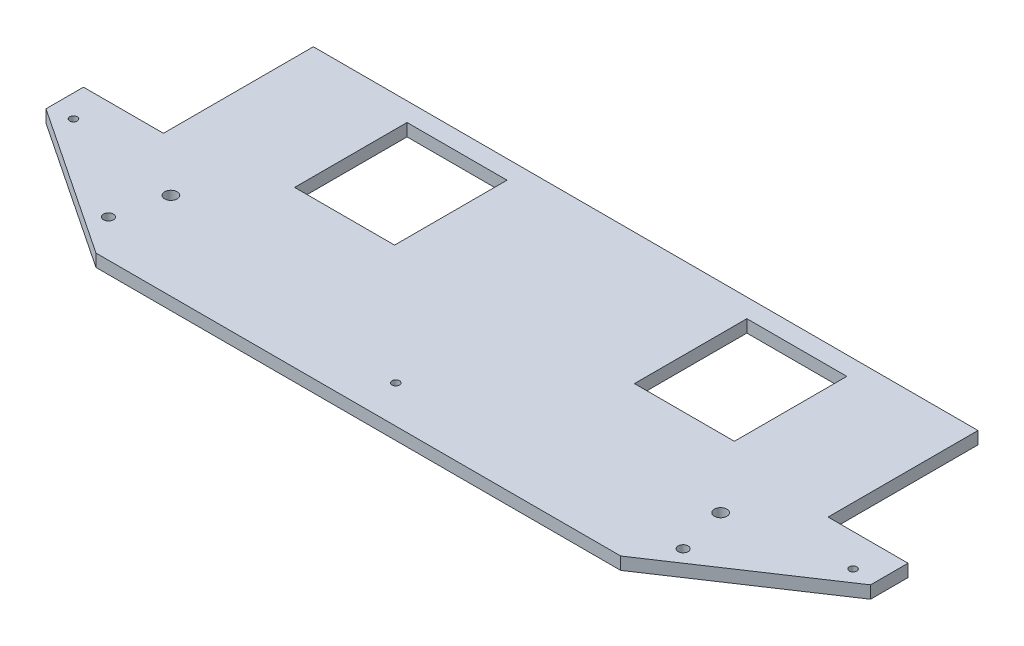
ISO-10303-21;
HEADER;
FILE_DESCRIPTION(('STEP AP214'),'2;1');
FILE_NAME('part.step','',(''),(''),'','','');
FILE_SCHEMA(('AUTOMOTIVE_DESIGN { 1 0 10303 214 1 1 1 1 }'));
ENDSEC;
DATA;
#1=APPLICATION_CONTEXT('core data for automotive mechanical design processes');
#2=APPLICATION_PROTOCOL_DEFINITION('international standard','automotive_design',2000,#1);
#3=PRODUCT_CONTEXT('',#1,'mechanical');
#4=PRODUCT('Part','Part','',(#3));
#5=PRODUCT_RELATED_PRODUCT_CATEGORY('part','',(#4));
#6=PRODUCT_DEFINITION_FORMATION('','',#4);
#7=PRODUCT_DEFINITION_CONTEXT('part definition',#1,'design');
#8=PRODUCT_DEFINITION('design','',#6,#7);
#9=PRODUCT_DEFINITION_SHAPE('','',#8);
#10=(LENGTH_UNIT() NAMED_UNIT(*) SI_UNIT(.MILLI.,.METRE.));
#11=(NAMED_UNIT(*) PLANE_ANGLE_UNIT() SI_UNIT($,.RADIAN.));
#12=(NAMED_UNIT(*) SI_UNIT($,.STERADIAN.) SOLID_ANGLE_UNIT());
#13=UNCERTAINTY_MEASURE_WITH_UNIT(LENGTH_MEASURE(1.E-05),#10,'distance_accuracy_value','');
#14=(GEOMETRIC_REPRESENTATION_CONTEXT(3) GLOBAL_UNCERTAINTY_ASSIGNED_CONTEXT((#13)) GLOBAL_UNIT_ASSIGNED_CONTEXT((#10,
#11,#12)) REPRESENTATION_CONTEXT('',''));
#15=CARTESIAN_POINT('',(0.,0.,0.));
#16=DIRECTION('',(0.,0.,1.));
#17=DIRECTION('',(1.,0.,0.));
#18=AXIS2_PLACEMENT_3D('',#15,#16,#17);
#19=CARTESIAN_POINT('',(-54.8240449438202,5.,16.2531460674157));
#20=DIRECTION('',(0.,1.,0.));
#21=DIRECTION('',(0.,0.,1.));
#22=AXIS2_PLACEMENT_3D('',#19,#20,#21);
#23=PLANE('',#22);
#24=CARTESIAN_POINT('',(110.17595505618,5.,-118.746853932584));
#25=DIRECTION('',(0.,1.,0.));
#26=DIRECTION('',(0.,0.,1.));
#27=AXIS2_PLACEMENT_3D('',#24,#25,#26);
#28=CIRCLE('',#27,1.5);
#29=CARTESIAN_POINT('',(110.17595505618,5.,-117.246853932584));
#30=VERTEX_POINT('',#29);
#31=EDGE_CURVE('E315',#30,#30,#28,.T.);
#32=ORIENTED_EDGE('',*,*,#31,.F.);
#33=EDGE_LOOP('',(#32));
#34=FACE_BOUND('',#33,.T.);
#35=CARTESIAN_POINT('',(-45.8240449438203,5.,-145.746853932584));
#36=DIRECTION('',(0.,1.,0.));
#37=DIRECTION('',(0.,0.,1.));
#38=AXIS2_PLACEMENT_3D('',#35,#36,#37);
#39=CIRCLE('',#38,1.5);
#40=CARTESIAN_POINT('',(-45.8240449438203,5.,-144.246853932584));
#41=VERTEX_POINT('',#40);
#42=EDGE_CURVE('E320',#41,#41,#39,.T.);
#43=ORIENTED_EDGE('',*,*,#42,.F.);
#44=EDGE_LOOP('',(#43));
#45=FACE_BOUND('',#44,.T.);
#46=CARTESIAN_POINT('',(266.17595505618,5.,-145.746853932584));
#47=DIRECTION('',(0.,1.,0.));
#48=DIRECTION('',(0.,0.,1.));
#49=AXIS2_PLACEMENT_3D('',#46,#47,#48);
#50=CIRCLE('',#49,1.49999999999996);
#51=CARTESIAN_POINT('',(266.17595505618,5.,-144.246853932584));
#52=VERTEX_POINT('',#51);
#53=EDGE_CURVE('E323',#52,#52,#50,.T.);
#54=ORIENTED_EDGE('',*,*,#53,.F.);
#55=EDGE_LOOP('',(#54));
#56=FACE_BOUND('',#55,.T.);
#57=CARTESIAN_POINT('',(220.17595505618,5.,-138.746853932584));
#58=DIRECTION('',(0.,1.,0.));
#59=DIRECTION('',(0.,0.,1.));
#60=AXIS2_PLACEMENT_3D('',#57,#58,#59);
#61=CIRCLE('',#60,2.5);
#62=CARTESIAN_POINT('',(220.17595505618,5.,-136.246853932584));
#63=VERTEX_POINT('',#62);
#64=EDGE_CURVE('E326',#63,#63,#61,.T.);
#65=ORIENTED_EDGE('',*,*,#64,.F.);
#66=EDGE_LOOP('',(#65));
#67=FACE_BOUND('',#66,.T.);
#68=CARTESIAN_POINT('',(0.17595505617965,5.,-138.746853932584));
#69=DIRECTION('',(0.,1.,0.));
#70=DIRECTION('',(0.,0.,1.));
#71=AXIS2_PLACEMENT_3D('',#68,#69,#70);
#72=CIRCLE('',#71,2.5);
#73=CARTESIAN_POINT('',(0.17595505617965,5.,-136.246853932584));
#74=VERTEX_POINT('',#73);
#75=EDGE_CURVE('E329',#74,#74,#72,.T.);
#76=ORIENTED_EDGE('',*,*,#75,.F.);
#77=EDGE_LOOP('',(#76));
#78=FACE_BOUND('',#77,.T.);
#79=CARTESIAN_POINT('',(225.17595505618,5.,-118.746853932584));
#80=DIRECTION('',(0.,-1.,0.));
#81=DIRECTION('',(0.,0.,1.));
#82=AXIS2_PLACEMENT_3D('',#79,#80,#81);
#83=CIRCLE('',#82,2.);
#84=CARTESIAN_POINT('',(225.17595505618,5.,-116.746853932584));
#85=VERTEX_POINT('',#84);
#86=EDGE_CURVE('E309',#85,#85,#83,.T.);
#87=ORIENTED_EDGE('',*,*,#86,.T.);
#88=EDGE_LOOP('',(#87));
#89=FACE_BOUND('',#88,.T.);
#90=CARTESIAN_POINT('',(-4.82404494382026,5.,-118.746853932584));
#91=DIRECTION('',(0.,-1.,0.));
#92=DIRECTION('',(0.,0.,-1.));
#93=AXIS2_PLACEMENT_3D('',#90,#91,#92);
#94=CIRCLE('',#93,2.);
#95=CARTESIAN_POINT('',(-4.82404494382026,5.,-120.746853932584));
#96=VERTEX_POINT('',#95);
#97=EDGE_CURVE('E303',#96,#96,#94,.T.);
#98=ORIENTED_EDGE('',*,*,#97,.T.);
#99=EDGE_LOOP('',(#98));
#100=FACE_BOUND('',#99,.T.);
#101=DIRECTION('',(0.832050294337844,0.,-0.554700196225229));
#102=VECTOR('',#101,1.);
#103=CARTESIAN_POINT('',(215.17595505618,5.,-103.746853932584));
#104=LINE('',#103,#102);
#105=CARTESIAN_POINT('',(215.17595505618,5.,-103.746853932584));
#106=VERTEX_POINT('',#105);
#107=CARTESIAN_POINT('',(275.17595505618,5.,-143.746853932584));
#108=VERTEX_POINT('',#107);
#109=EDGE_CURVE('E177',#106,#108,#104,.T.);
#110=ORIENTED_EDGE('',*,*,#109,.T.);
#111=DIRECTION('',(0.,0.,-1.));
#112=VECTOR('',#111,1.);
#113=CARTESIAN_POINT('',(275.17595505618,5.,-233.746853932584));
#114=LINE('',#113,#112);
#115=CARTESIAN_POINT('',(275.17595505618,5.,-158.746853932584));
#116=VERTEX_POINT('',#115);
#117=EDGE_CURVE('E11',#108,#116,#114,.T.);
#118=ORIENTED_EDGE('',*,*,#117,.T.);
#119=DIRECTION('',(1.,0.,0.));
#120=VECTOR('',#119,1.);
#121=CARTESIAN_POINT('',(275.17595505618,5.,-158.746853932584));
#122=LINE('',#121,#120);
#123=CARTESIAN_POINT('',(243.17595505618,5.,-158.746853932584));
#124=VERTEX_POINT('',#123);
#125=EDGE_CURVE('E215',#124,#116,#122,.T.);
#126=ORIENTED_EDGE('',*,*,#125,.F.);
#127=DIRECTION('',(0.,0.,1.));
#128=VECTOR('',#127,1.);
#129=CARTESIAN_POINT('',(243.17595505618,5.,-218.746853932584));
#130=LINE('',#129,#128);
#131=CARTESIAN_POINT('',(243.17595505618,5.,-218.746853932584));
#132=VERTEX_POINT('',#131);
#133=EDGE_CURVE('E219',#132,#124,#130,.T.);
#134=ORIENTED_EDGE('',*,*,#133,.F.);
#135=DIRECTION('',(1.,0.,0.));
#136=VECTOR('',#135,1.);
#137=CARTESIAN_POINT('',(275.17595505618,5.,-218.746853932584));
#138=LINE('',#137,#136);
#139=CARTESIAN_POINT('',(-22.8240449438203,5.,-218.746853932584));
#140=VERTEX_POINT('',#139);
#141=EDGE_CURVE('E278',#140,#132,#138,.T.);
#142=ORIENTED_EDGE('',*,*,#141,.F.);
#143=DIRECTION('',(0.,0.,-1.));
#144=VECTOR('',#143,1.);
#145=CARTESIAN_POINT('',(-22.8240449438203,5.,-218.746853932584));
#146=LINE('',#145,#144);
#147=CARTESIAN_POINT('',(-22.8240449438203,5.,-158.746853932584));
#148=VERTEX_POINT('',#147);
#149=EDGE_CURVE('E196',#148,#140,#146,.T.);
#150=ORIENTED_EDGE('',*,*,#149,.F.);
#151=DIRECTION('',(1.,0.,0.));
#152=VECTOR('',#151,1.);
#153=CARTESIAN_POINT('',(-54.8240449438203,5.,-158.746853932584));
#154=LINE('',#153,#152);
#155=CARTESIAN_POINT('',(-54.8240449438203,5.,-158.746853932584));
#156=VERTEX_POINT('',#155);
#157=EDGE_CURVE('E184',#156,#148,#154,.T.);
#158=ORIENTED_EDGE('',*,*,#157,.F.);
#159=DIRECTION('',(0.,0.,1.));
#160=VECTOR('',#159,1.);
#161=CARTESIAN_POINT('',(-54.8240449438203,5.,-233.746853932584));
#162=LINE('',#161,#160);
#163=CARTESIAN_POINT('',(-54.8240449438204,5.,-143.746853932584));
#164=VERTEX_POINT('',#163);
#165=EDGE_CURVE('E42',#156,#164,#162,.T.);
#166=ORIENTED_EDGE('',*,*,#165,.T.);
#167=DIRECTION('',(0.832050294337844,0.,0.554700196225229));
#168=VECTOR('',#167,1.);
#169=CARTESIAN_POINT('',(-54.8240449438204,5.,-143.746853932584));
#170=LINE('',#169,#168);
#171=CARTESIAN_POINT('',(5.17595505617962,5.,-103.746853932584));
#172=VERTEX_POINT('',#171);
#173=EDGE_CURVE('E158',#164,#172,#170,.T.);
#174=ORIENTED_EDGE('',*,*,#173,.T.);
#175=DIRECTION('',(1.,0.,0.));
#176=VECTOR('',#175,1.);
#177=CARTESIAN_POINT('',(5.17595505617962,5.,-103.746853932584));
#178=LINE('',#177,#176);
#179=EDGE_CURVE('E169',#172,#106,#178,.T.);
#180=ORIENTED_EDGE('',*,*,#179,.T.);
#181=EDGE_LOOP('',(#110,#118,#126,#134,#142,#150,#158,#166,#174,#180));
#182=FACE_BOUND('',#181,.T.);
#183=DIRECTION('',(0.,0.,1.));
#184=VECTOR('',#183,1.);
#185=CARTESIAN_POINT('',(22.1759550561797,5.,-211.246853932584));
#186=LINE('',#185,#184);
#187=CARTESIAN_POINT('',(22.1759550561797,5.,-211.246853932584));
#188=VERTEX_POINT('',#187);
#189=CARTESIAN_POINT('',(22.1759550561797,5.,-166.246853932584));
#190=VERTEX_POINT('',#189);
#191=EDGE_CURVE('E58',#188,#190,#186,.T.);
#192=ORIENTED_EDGE('',*,*,#191,.F.);
#193=DIRECTION('',(-1.,0.,0.));
#194=VECTOR('',#193,1.);
#195=CARTESIAN_POINT('',(22.1759550561797,5.,-211.246853932584));
#196=LINE('',#195,#194);
#197=CARTESIAN_POINT('',(62.1759550561797,5.,-211.246853932584));
#198=VERTEX_POINT('',#197);
#199=EDGE_CURVE('E267',#198,#188,#196,.T.);
#200=ORIENTED_EDGE('',*,*,#199,.F.);
#201=DIRECTION('',(0.,0.,-1.));
#202=VECTOR('',#201,1.);
#203=CARTESIAN_POINT('',(62.1759550561797,5.,-211.246853932584));
#204=LINE('',#203,#202);
#205=CARTESIAN_POINT('',(62.1759550561797,5.,-166.246853932584));
#206=VERTEX_POINT('',#205);
#207=EDGE_CURVE('E271',#206,#198,#204,.T.);
#208=ORIENTED_EDGE('',*,*,#207,.F.);
#209=DIRECTION('',(1.,0.,0.));
#210=VECTOR('',#209,1.);
#211=CARTESIAN_POINT('',(22.1759550561797,5.,-166.246853932584));
#212=LINE('',#211,#210);
#213=EDGE_CURVE('E274',#190,#206,#212,.T.);
#214=ORIENTED_EDGE('',*,*,#213,.F.);
#215=EDGE_LOOP('',(#192,#200,#208,#214));
#216=FACE_BOUND('',#215,.T.);
#217=DIRECTION('',(0.,0.,-1.));
#218=VECTOR('',#217,1.);
#219=CARTESIAN_POINT('',(198.17595505618,5.,-211.246853932584));
#220=LINE('',#219,#218);
#221=CARTESIAN_POINT('',(198.17595505618,5.,-166.246853932584));
#222=VERTEX_POINT('',#221);
#223=CARTESIAN_POINT('',(198.17595505618,5.,-211.246853932584));
#224=VERTEX_POINT('',#223);
#225=EDGE_CURVE('E246',#222,#224,#220,.T.);
#226=ORIENTED_EDGE('',*,*,#225,.F.);
#227=DIRECTION('',(1.,0.,0.));
#228=VECTOR('',#227,1.);
#229=CARTESIAN_POINT('',(198.17595505618,5.,-166.246853932584));
#230=LINE('',#229,#228);
#231=CARTESIAN_POINT('',(158.17595505618,5.,-166.246853932584));
#232=VERTEX_POINT('',#231);
#233=EDGE_CURVE('E236',#232,#222,#230,.T.);
#234=ORIENTED_EDGE('',*,*,#233,.F.);
#235=DIRECTION('',(0.,0.,1.));
#236=VECTOR('',#235,1.);
#237=CARTESIAN_POINT('',(158.17595505618,5.,-211.246853932584));
#238=LINE('',#237,#236);
#239=CARTESIAN_POINT('',(158.17595505618,5.,-211.246853932584));
#240=VERTEX_POINT('',#239);
#241=EDGE_CURVE('E240',#240,#232,#238,.T.);
#242=ORIENTED_EDGE('',*,*,#241,.F.);
#243=DIRECTION('',(-1.,0.,0.));
#244=VECTOR('',#243,1.);
#245=CARTESIAN_POINT('',(198.17595505618,5.,-211.246853932584));
#246=LINE('',#245,#244);
#247=EDGE_CURVE('E243',#224,#240,#246,.T.);
#248=ORIENTED_EDGE('',*,*,#247,.F.);
#249=EDGE_LOOP('',(#226,#234,#242,#248));
#250=FACE_BOUND('',#249,.T.);
#251=ADVANCED_FACE('F33',(#34,#45,#56,#67,#78,#89,#100,#182,#216,#250),#23,.T.);
#252=CARTESIAN_POINT('',(-54.8240449438202,0.,16.2531460674157));
#253=DIRECTION('',(0.,1.,0.));
#254=DIRECTION('',(0.,0.,1.));
#255=AXIS2_PLACEMENT_3D('',#252,#253,#254);
#256=PLANE('',#255);
#257=CARTESIAN_POINT('',(110.17595505618,0.,-118.746853932584));
#258=DIRECTION('',(0.,-1.,0.));
#259=DIRECTION('',(0.,0.,-1.));
#260=AXIS2_PLACEMENT_3D('',#257,#258,#259);
#261=CIRCLE('',#260,1.5);
#262=CARTESIAN_POINT('',(110.17595505618,0.,-120.246853932584));
#263=VERTEX_POINT('',#262);
#264=EDGE_CURVE('E336',#263,#263,#261,.T.);
#265=ORIENTED_EDGE('',*,*,#264,.F.);
#266=EDGE_LOOP('',(#265));
#267=FACE_BOUND('',#266,.T.);
#268=CARTESIAN_POINT('',(-45.8240449438203,0.,-145.746853932584));
#269=DIRECTION('',(0.,-1.,0.));
#270=DIRECTION('',(0.,0.,-1.));
#271=AXIS2_PLACEMENT_3D('',#268,#269,#270);
#272=CIRCLE('',#271,1.5);
#273=CARTESIAN_POINT('',(-45.8240449438203,0.,-147.246853932584));
#274=VERTEX_POINT('',#273);
#275=EDGE_CURVE('E339',#274,#274,#272,.T.);
#276=ORIENTED_EDGE('',*,*,#275,.F.);
#277=EDGE_LOOP('',(#276));
#278=FACE_BOUND('',#277,.T.);
#279=CARTESIAN_POINT('',(266.17595505618,0.,-145.746853932584));
#280=DIRECTION('',(0.,-1.,0.));
#281=DIRECTION('',(0.,0.,1.));
#282=AXIS2_PLACEMENT_3D('',#279,#280,#281);
#283=CIRCLE('',#282,1.49999999999996);
#284=CARTESIAN_POINT('',(266.17595505618,0.,-144.246853932584));
#285=VERTEX_POINT('',#284);
#286=EDGE_CURVE('E342',#285,#285,#283,.T.);
#287=ORIENTED_EDGE('',*,*,#286,.F.);
#288=EDGE_LOOP('',(#287));
#289=FACE_BOUND('',#288,.T.);
#290=CARTESIAN_POINT('',(220.17595505618,0.,-138.746853932584));
#291=DIRECTION('',(0.,-1.,0.));
#292=DIRECTION('',(0.,0.,1.));
#293=AXIS2_PLACEMENT_3D('',#290,#291,#292);
#294=CIRCLE('',#293,2.5);
#295=CARTESIAN_POINT('',(220.17595505618,0.,-136.246853932584));
#296=VERTEX_POINT('',#295);
#297=EDGE_CURVE('E335',#296,#296,#294,.T.);
#298=ORIENTED_EDGE('',*,*,#297,.F.);
#299=EDGE_LOOP('',(#298));
#300=FACE_BOUND('',#299,.T.);
#301=CARTESIAN_POINT('',(0.17595505617965,0.,-138.746853932584));
#302=DIRECTION('',(0.,-1.,0.));
#303=DIRECTION('',(0.,0.,-1.));
#304=AXIS2_PLACEMENT_3D('',#301,#302,#303);
#305=CIRCLE('',#304,2.5);
#306=CARTESIAN_POINT('',(0.17595505617965,0.,-141.246853932584));
#307=VERTEX_POINT('',#306);
#308=EDGE_CURVE('E332',#307,#307,#305,.T.);
#309=ORIENTED_EDGE('',*,*,#308,.F.);
#310=EDGE_LOOP('',(#309));
#311=FACE_BOUND('',#310,.T.);
#312=CARTESIAN_POINT('',(225.17595505618,0.,-118.746853932584));
#313=DIRECTION('',(0.,-1.,0.));
#314=DIRECTION('',(0.,0.,1.));
#315=AXIS2_PLACEMENT_3D('',#312,#313,#314);
#316=CIRCLE('',#315,2.);
#317=CARTESIAN_POINT('',(225.17595505618,0.,-116.746853932584));
#318=VERTEX_POINT('',#317);
#319=EDGE_CURVE('E312',#318,#318,#316,.T.);
#320=ORIENTED_EDGE('',*,*,#319,.F.);
#321=EDGE_LOOP('',(#320));
#322=FACE_BOUND('',#321,.T.);
#323=CARTESIAN_POINT('',(-4.82404494382026,0.,-118.746853932584));
#324=DIRECTION('',(0.,-1.,0.));
#325=DIRECTION('',(0.,0.,-1.));
#326=AXIS2_PLACEMENT_3D('',#323,#324,#325);
#327=CIRCLE('',#326,2.);
#328=CARTESIAN_POINT('',(-4.82404494382026,0.,-120.746853932584));
#329=VERTEX_POINT('',#328);
#330=EDGE_CURVE('E306',#329,#329,#327,.T.);
#331=ORIENTED_EDGE('',*,*,#330,.F.);
#332=EDGE_LOOP('',(#331));
#333=FACE_BOUND('',#332,.T.);
#334=DIRECTION('',(1.,0.,0.));
#335=VECTOR('',#334,1.);
#336=CARTESIAN_POINT('',(198.17595505618,0.,-166.246853932584));
#337=LINE('',#336,#335);
#338=CARTESIAN_POINT('',(158.17595505618,0.,-166.246853932584));
#339=VERTEX_POINT('',#338);
#340=CARTESIAN_POINT('',(198.17595505618,0.,-166.246853932584));
#341=VERTEX_POINT('',#340);
#342=EDGE_CURVE('E231',#339,#341,#337,.T.);
#343=ORIENTED_EDGE('',*,*,#342,.T.);
#344=DIRECTION('',(0.,0.,-1.));
#345=VECTOR('',#344,1.);
#346=CARTESIAN_POINT('',(198.17595505618,0.,-211.246853932584));
#347=LINE('',#346,#345);
#348=CARTESIAN_POINT('',(198.17595505618,0.,-211.246853932584));
#349=VERTEX_POINT('',#348);
#350=EDGE_CURVE('E239',#341,#349,#347,.T.);
#351=ORIENTED_EDGE('',*,*,#350,.T.);
#352=DIRECTION('',(-1.,0.,0.));
#353=VECTOR('',#352,1.);
#354=CARTESIAN_POINT('',(198.17595505618,0.,-211.246853932584));
#355=LINE('',#354,#353);
#356=CARTESIAN_POINT('',(158.17595505618,0.,-211.246853932584));
#357=VERTEX_POINT('',#356);
#358=EDGE_CURVE('E254',#349,#357,#355,.T.);
#359=ORIENTED_EDGE('',*,*,#358,.T.);
#360=DIRECTION('',(0.,0.,1.));
#361=VECTOR('',#360,1.);
#362=CARTESIAN_POINT('',(158.17595505618,0.,-211.246853932584));
#363=LINE('',#362,#361);
#364=EDGE_CURVE('E251',#357,#339,#363,.T.);
#365=ORIENTED_EDGE('',*,*,#364,.T.);
#366=EDGE_LOOP('',(#343,#351,#359,#365));
#367=FACE_BOUND('',#366,.T.);
#368=DIRECTION('',(-1.,0.,0.));
#369=VECTOR('',#368,1.);
#370=CARTESIAN_POINT('',(22.1759550561797,0.,-211.246853932584));
#371=LINE('',#370,#369);
#372=CARTESIAN_POINT('',(62.1759550561797,0.,-211.246853932584));
#373=VERTEX_POINT('',#372);
#374=CARTESIAN_POINT('',(22.1759550561797,0.,-211.246853932584));
#375=VERTEX_POINT('',#374);
#376=EDGE_CURVE('E262',#373,#375,#371,.T.);
#377=ORIENTED_EDGE('',*,*,#376,.T.);
#378=DIRECTION('',(0.,0.,1.));
#379=VECTOR('',#378,1.);
#380=CARTESIAN_POINT('',(22.1759550561797,0.,-211.246853932584));
#381=LINE('',#380,#379);
#382=CARTESIAN_POINT('',(22.1759550561797,0.,-166.246853932584));
#383=VERTEX_POINT('',#382);
#384=EDGE_CURVE('E270',#375,#383,#381,.T.);
#385=ORIENTED_EDGE('',*,*,#384,.T.);
#386=DIRECTION('',(1.,0.,0.));
#387=VECTOR('',#386,1.);
#388=CARTESIAN_POINT('',(22.1759550561797,0.,-166.246853932584));
#389=LINE('',#388,#387);
#390=CARTESIAN_POINT('',(62.1759550561797,0.,-166.246853932584));
#391=VERTEX_POINT('',#390);
#392=EDGE_CURVE('E284',#383,#391,#389,.T.);
#393=ORIENTED_EDGE('',*,*,#392,.T.);
#394=DIRECTION('',(0.,0.,-1.));
#395=VECTOR('',#394,1.);
#396=CARTESIAN_POINT('',(62.1759550561797,0.,-211.246853932584));
#397=LINE('',#396,#395);
#398=EDGE_CURVE('E281',#391,#373,#397,.T.);
#399=ORIENTED_EDGE('',*,*,#398,.T.);
#400=EDGE_LOOP('',(#377,#385,#393,#399));
#401=FACE_BOUND('',#400,.T.);
#402=DIRECTION('',(0.,0.,-1.));
#403=VECTOR('',#402,1.);
#404=CARTESIAN_POINT('',(275.17595505618,0.,-233.746853932584));
#405=LINE('',#404,#403);
#406=CARTESIAN_POINT('',(275.17595505618,0.,-143.746853932584));
#407=VERTEX_POINT('',#406);
#408=CARTESIAN_POINT('',(275.17595505618,0.,-158.746853932584));
#409=VERTEX_POINT('',#408);
#410=EDGE_CURVE('E37',#407,#409,#405,.T.);
#411=ORIENTED_EDGE('',*,*,#410,.F.);
#412=DIRECTION('',(0.832050294337844,0.,-0.554700196225229));
#413=VECTOR('',#412,1.);
#414=CARTESIAN_POINT('',(215.17595505618,0.,-103.746853932584));
#415=LINE('',#414,#413);
#416=CARTESIAN_POINT('',(215.17595505618,0.,-103.746853932584));
#417=VERTEX_POINT('',#416);
#418=EDGE_CURVE('E50',#417,#407,#415,.T.);
#419=ORIENTED_EDGE('',*,*,#418,.F.);
#420=DIRECTION('',(1.,0.,0.));
#421=VECTOR('',#420,1.);
#422=CARTESIAN_POINT('',(5.17595505617962,0.,-103.746853932584));
#423=LINE('',#422,#421);
#424=CARTESIAN_POINT('',(5.17595505617962,0.,-103.746853932584));
#425=VERTEX_POINT('',#424);
#426=EDGE_CURVE('E298',#425,#417,#423,.T.);
#427=ORIENTED_EDGE('',*,*,#426,.F.);
#428=DIRECTION('',(0.832050294337844,0.,0.554700196225229));
#429=VECTOR('',#428,1.);
#430=CARTESIAN_POINT('',(-54.8240449438204,0.,-143.746853932584));
#431=LINE('',#430,#429);
#432=CARTESIAN_POINT('',(-54.8240449438204,0.,-143.746853932584));
#433=VERTEX_POINT('',#432);
#434=EDGE_CURVE('E301',#433,#425,#431,.T.);
#435=ORIENTED_EDGE('',*,*,#434,.F.);
#436=DIRECTION('',(0.,0.,1.));
#437=VECTOR('',#436,1.);
#438=CARTESIAN_POINT('',(-54.8240449438203,0.,-233.746853932584));
#439=LINE('',#438,#437);
#440=CARTESIAN_POINT('',(-54.8240449438203,0.,-158.746853932584));
#441=VERTEX_POINT('',#440);
#442=EDGE_CURVE('E176',#441,#433,#439,.T.);
#443=ORIENTED_EDGE('',*,*,#442,.F.);
#444=DIRECTION('',(1.,0.,0.));
#445=VECTOR('',#444,1.);
#446=CARTESIAN_POINT('',(-54.8240449438203,0.,-158.746853932584));
#447=LINE('',#446,#445);
#448=CARTESIAN_POINT('',(-22.8240449438203,0.,-158.746853932584));
#449=VERTEX_POINT('',#448);
#450=EDGE_CURVE('E199',#441,#449,#447,.T.);
#451=ORIENTED_EDGE('',*,*,#450,.T.);
#452=DIRECTION('',(0.,0.,-1.));
#453=VECTOR('',#452,1.);
#454=CARTESIAN_POINT('',(-22.8240449438203,0.,-218.746853932584));
#455=LINE('',#454,#453);
#456=CARTESIAN_POINT('',(-22.8240449438203,0.,-218.746853932584));
#457=VERTEX_POINT('',#456);
#458=EDGE_CURVE('E202',#449,#457,#455,.T.);
#459=ORIENTED_EDGE('',*,*,#458,.T.);
#460=DIRECTION('',(-1.,0.,0.));
#461=VECTOR('',#460,1.);
#462=CARTESIAN_POINT('',(275.17595505618,0.,-218.746853932584));
#463=LINE('',#462,#461);
#464=CARTESIAN_POINT('',(243.17595505618,0.,-218.746853932584));
#465=VERTEX_POINT('',#464);
#466=EDGE_CURVE('E290',#465,#457,#463,.T.);
#467=ORIENTED_EDGE('',*,*,#466,.F.);
#468=DIRECTION('',(0.,0.,1.));
#469=VECTOR('',#468,1.);
#470=CARTESIAN_POINT('',(243.17595505618,0.,-218.746853932584));
#471=LINE('',#470,#469);
#472=CARTESIAN_POINT('',(243.17595505618,0.,-158.746853932584));
#473=VERTEX_POINT('',#472);
#474=EDGE_CURVE('E218',#465,#473,#471,.T.);
#475=ORIENTED_EDGE('',*,*,#474,.T.);
#476=DIRECTION('',(1.,0.,0.));
#477=VECTOR('',#476,1.);
#478=CARTESIAN_POINT('',(275.17595505618,0.,-158.746853932584));
#479=LINE('',#478,#477);
#480=EDGE_CURVE('E211',#473,#409,#479,.T.);
#481=ORIENTED_EDGE('',*,*,#480,.T.);
#482=EDGE_LOOP('',(#411,#419,#427,#435,#443,#451,#459,#467,#475,#481));
#483=FACE_BOUND('',#482,.T.);
#484=ADVANCED_FACE('F350',(#267,#278,#289,#300,#311,#322,#333,#367,#401,#483),#256,.F.);
#485=CARTESIAN_POINT('',(-54.8240449438203,5.,-233.746853932584));
#486=DIRECTION('',(1.,0.,0.));
#487=DIRECTION('',(0.,0.,-1.));
#488=AXIS2_PLACEMENT_3D('',#485,#486,#487);
#489=PLANE('',#488);
#490=ORIENTED_EDGE('',*,*,#442,.T.);
#491=DIRECTION('',(0.,-1.,0.));
#492=VECTOR('',#491,1.);
#493=CARTESIAN_POINT('',(-54.8240449438204,5.,-143.746853932584));
#494=LINE('',#493,#492);
#495=EDGE_CURVE('E162',#164,#433,#494,.T.);
#496=ORIENTED_EDGE('',*,*,#495,.F.);
#497=ORIENTED_EDGE('',*,*,#165,.F.);
#498=DIRECTION('',(0.,1.,0.));
#499=VECTOR('',#498,1.);
#500=CARTESIAN_POINT('',(-54.8240449438203,0.,-158.746853932584));
#501=LINE('',#500,#499);
#502=EDGE_CURVE('E187',#441,#156,#501,.T.);
#503=ORIENTED_EDGE('',*,*,#502,.F.);
#504=EDGE_LOOP('',(#490,#496,#497,#503));
#505=FACE_BOUND('',#504,.T.);
#506=ADVANCED_FACE('F35',(#505),#489,.F.);
#507=CARTESIAN_POINT('',(275.17595505618,5.,-233.746853932584));
#508=DIRECTION('',(-1.,0.,0.));
#509=DIRECTION('',(0.,0.,1.));
#510=AXIS2_PLACEMENT_3D('',#507,#508,#509);
#511=PLANE('',#510);
#512=ORIENTED_EDGE('',*,*,#117,.F.);
#513=DIRECTION('',(0.,-1.,0.));
#514=VECTOR('',#513,1.);
#515=CARTESIAN_POINT('',(275.17595505618,5.,-143.746853932584));
#516=LINE('',#515,#514);
#517=EDGE_CURVE('E291',#108,#407,#516,.T.);
#518=ORIENTED_EDGE('',*,*,#517,.T.);
#519=ORIENTED_EDGE('',*,*,#410,.T.);
#520=DIRECTION('',(0.,1.,0.));
#521=VECTOR('',#520,1.);
#522=CARTESIAN_POINT('',(275.17595505618,0.,-158.746853932584));
#523=LINE('',#522,#521);
#524=EDGE_CURVE('E201',#409,#116,#523,.T.);
#525=ORIENTED_EDGE('',*,*,#524,.T.);
#526=EDGE_LOOP('',(#512,#518,#519,#525));
#527=FACE_BOUND('',#526,.T.);
#528=ADVANCED_FACE('F370',(#527),#511,.F.);
#529=CARTESIAN_POINT('',(-22.8240449438203,0.,-218.746853932584));
#530=DIRECTION('',(1.,0.,0.));
#531=DIRECTION('',(0.,0.,-1.));
#532=AXIS2_PLACEMENT_3D('',#529,#530,#531);
#533=PLANE('',#532);
#534=ORIENTED_EDGE('',*,*,#149,.T.);
#535=DIRECTION('',(0.,1.,0.));
#536=VECTOR('',#535,1.);
#537=CARTESIAN_POINT('',(-22.8240449438203,0.,-218.746853932584));
#538=LINE('',#537,#536);
#539=EDGE_CURVE('E189',#457,#140,#538,.T.);
#540=ORIENTED_EDGE('',*,*,#539,.F.);
#541=ORIENTED_EDGE('',*,*,#458,.F.);
#542=DIRECTION('',(0.,1.,0.));
#543=VECTOR('',#542,1.);
#544=CARTESIAN_POINT('',(-22.8240449438203,0.,-158.746853932584));
#545=LINE('',#544,#543);
#546=EDGE_CURVE('E190',#449,#148,#545,.T.);
#547=ORIENTED_EDGE('',*,*,#546,.T.);
#548=EDGE_LOOP('',(#534,#540,#541,#547));
#549=FACE_BOUND('',#548,.T.);
#550=ADVANCED_FACE('F385',(#549),#533,.F.);
#551=CARTESIAN_POINT('',(-54.8240449438203,0.,-158.746853932584));
#552=DIRECTION('',(0.,0.,1.));
#553=DIRECTION('',(1.,0.,0.));
#554=AXIS2_PLACEMENT_3D('',#551,#552,#553);
#555=PLANE('',#554);
#556=ORIENTED_EDGE('',*,*,#157,.T.);
#557=ORIENTED_EDGE('',*,*,#546,.F.);
#558=ORIENTED_EDGE('',*,*,#450,.F.);
#559=ORIENTED_EDGE('',*,*,#502,.T.);
#560=EDGE_LOOP('',(#556,#557,#558,#559));
#561=FACE_BOUND('',#560,.T.);
#562=ADVANCED_FACE('F383',(#561),#555,.F.);
#563=CARTESIAN_POINT('',(275.17595505618,0.,-158.746853932584));
#564=DIRECTION('',(0.,0.,1.));
#565=DIRECTION('',(1.,0.,0.));
#566=AXIS2_PLACEMENT_3D('',#563,#564,#565);
#567=PLANE('',#566);
#568=ORIENTED_EDGE('',*,*,#125,.T.);
#569=ORIENTED_EDGE('',*,*,#524,.F.);
#570=ORIENTED_EDGE('',*,*,#480,.F.);
#571=DIRECTION('',(0.,1.,0.));
#572=VECTOR('',#571,1.);
#573=CARTESIAN_POINT('',(243.17595505618,0.,-158.746853932584));
#574=LINE('',#573,#572);
#575=EDGE_CURVE('E210',#473,#124,#574,.T.);
#576=ORIENTED_EDGE('',*,*,#575,.T.);
#577=EDGE_LOOP('',(#568,#569,#570,#576));
#578=FACE_BOUND('',#577,.T.);
#579=ADVANCED_FACE('F372',(#578),#567,.F.);
#580=CARTESIAN_POINT('',(243.17595505618,0.,-218.746853932584));
#581=DIRECTION('',(-1.,0.,0.));
#582=DIRECTION('',(0.,0.,1.));
#583=AXIS2_PLACEMENT_3D('',#580,#581,#582);
#584=PLANE('',#583);
#585=ORIENTED_EDGE('',*,*,#133,.T.);
#586=ORIENTED_EDGE('',*,*,#575,.F.);
#587=ORIENTED_EDGE('',*,*,#474,.F.);
#588=DIRECTION('',(0.,1.,0.));
#589=VECTOR('',#588,1.);
#590=CARTESIAN_POINT('',(243.17595505618,0.,-218.746853932584));
#591=LINE('',#590,#589);
#592=EDGE_CURVE('E207',#465,#132,#591,.T.);
#593=ORIENTED_EDGE('',*,*,#592,.T.);
#594=EDGE_LOOP('',(#585,#586,#587,#593));
#595=FACE_BOUND('',#594,.T.);
#596=ADVANCED_FACE('F389',(#595),#584,.F.);
#597=CARTESIAN_POINT('',(198.17595505618,0.,-211.246853932584));
#598=DIRECTION('',(1.,0.,0.));
#599=DIRECTION('',(0.,0.,-1.));
#600=AXIS2_PLACEMENT_3D('',#597,#598,#599);
#601=PLANE('',#600);
#602=ORIENTED_EDGE('',*,*,#225,.T.);
#603=DIRECTION('',(0.,1.,0.));
#604=VECTOR('',#603,1.);
#605=CARTESIAN_POINT('',(198.17595505618,0.,-211.246853932584));
#606=LINE('',#605,#604);
#607=EDGE_CURVE('E227',#349,#224,#606,.T.);
#608=ORIENTED_EDGE('',*,*,#607,.F.);
#609=ORIENTED_EDGE('',*,*,#350,.F.);
#610=DIRECTION('',(0.,1.,0.));
#611=VECTOR('',#610,1.);
#612=CARTESIAN_POINT('',(198.17595505618,0.,-166.246853932584));
#613=LINE('',#612,#611);
#614=EDGE_CURVE('E222',#341,#222,#613,.T.);
#615=ORIENTED_EDGE('',*,*,#614,.T.);
#616=EDGE_LOOP('',(#602,#608,#609,#615));
#617=FACE_BOUND('',#616,.T.);
#618=ADVANCED_FACE('F391',(#617),#601,.F.);
#619=CARTESIAN_POINT('',(198.17595505618,0.,-166.246853932584));
#620=DIRECTION('',(0.,0.,1.));
#621=DIRECTION('',(1.,0.,0.));
#622=AXIS2_PLACEMENT_3D('',#619,#620,#621);
#623=PLANE('',#622);
#624=ORIENTED_EDGE('',*,*,#233,.T.);
#625=ORIENTED_EDGE('',*,*,#614,.F.);
#626=ORIENTED_EDGE('',*,*,#342,.F.);
#627=DIRECTION('',(0.,1.,0.));
#628=VECTOR('',#627,1.);
#629=CARTESIAN_POINT('',(158.17595505618,0.,-166.246853932584));
#630=LINE('',#629,#628);
#631=EDGE_CURVE('E233',#339,#232,#630,.T.);
#632=ORIENTED_EDGE('',*,*,#631,.T.);
#633=EDGE_LOOP('',(#624,#625,#626,#632));
#634=FACE_BOUND('',#633,.T.);
#635=ADVANCED_FACE('F397',(#634),#623,.F.);
#636=CARTESIAN_POINT('',(158.17595505618,0.,-211.246853932584));
#637=DIRECTION('',(-1.,0.,0.));
#638=DIRECTION('',(0.,0.,1.));
#639=AXIS2_PLACEMENT_3D('',#636,#637,#638);
#640=PLANE('',#639);
#641=ORIENTED_EDGE('',*,*,#241,.T.);
#642=ORIENTED_EDGE('',*,*,#631,.F.);
#643=ORIENTED_EDGE('',*,*,#364,.F.);
#644=DIRECTION('',(0.,1.,0.));
#645=VECTOR('',#644,1.);
#646=CARTESIAN_POINT('',(158.17595505618,0.,-211.246853932584));
#647=LINE('',#646,#645);
#648=EDGE_CURVE('E230',#357,#240,#647,.T.);
#649=ORIENTED_EDGE('',*,*,#648,.T.);
#650=EDGE_LOOP('',(#641,#642,#643,#649));
#651=FACE_BOUND('',#650,.T.);
#652=ADVANCED_FACE('F516',(#651),#640,.F.);
#653=CARTESIAN_POINT('',(198.17595505618,0.,-211.246853932584));
#654=DIRECTION('',(0.,0.,-1.));
#655=DIRECTION('',(-1.,0.,0.));
#656=AXIS2_PLACEMENT_3D('',#653,#654,#655);
#657=PLANE('',#656);
#658=ORIENTED_EDGE('',*,*,#247,.T.);
#659=ORIENTED_EDGE('',*,*,#648,.F.);
#660=ORIENTED_EDGE('',*,*,#358,.F.);
#661=ORIENTED_EDGE('',*,*,#607,.T.);
#662=EDGE_LOOP('',(#658,#659,#660,#661));
#663=FACE_BOUND('',#662,.T.);
#664=ADVANCED_FACE('F513',(#663),#657,.F.);
#665=CARTESIAN_POINT('',(22.1759550561797,0.,-211.246853932584));
#666=DIRECTION('',(-1.,0.,0.));
#667=DIRECTION('',(0.,0.,1.));
#668=AXIS2_PLACEMENT_3D('',#665,#666,#667);
#669=PLANE('',#668);
#670=ORIENTED_EDGE('',*,*,#191,.T.);
#671=DIRECTION('',(0.,1.,0.));
#672=VECTOR('',#671,1.);
#673=CARTESIAN_POINT('',(22.1759550561797,0.,-166.246853932584));
#674=LINE('',#673,#672);
#675=EDGE_CURVE('E259',#383,#190,#674,.T.);
#676=ORIENTED_EDGE('',*,*,#675,.F.);
#677=ORIENTED_EDGE('',*,*,#384,.F.);
#678=DIRECTION('',(0.,1.,0.));
#679=VECTOR('',#678,1.);
#680=CARTESIAN_POINT('',(22.1759550561797,0.,-211.246853932584));
#681=LINE('',#680,#679);
#682=EDGE_CURVE('E248',#375,#188,#681,.T.);
#683=ORIENTED_EDGE('',*,*,#682,.T.);
#684=EDGE_LOOP('',(#670,#676,#677,#683));
#685=FACE_BOUND('',#684,.T.);
#686=ADVANCED_FACE('F503',(#685),#669,.F.);
#687=CARTESIAN_POINT('',(22.1759550561797,0.,-211.246853932584));
#688=DIRECTION('',(0.,0.,-1.));
#689=DIRECTION('',(-1.,0.,0.));
#690=AXIS2_PLACEMENT_3D('',#687,#688,#689);
#691=PLANE('',#690);
#692=ORIENTED_EDGE('',*,*,#199,.T.);
#693=ORIENTED_EDGE('',*,*,#682,.F.);
#694=ORIENTED_EDGE('',*,*,#376,.F.);
#695=DIRECTION('',(0.,1.,0.));
#696=VECTOR('',#695,1.);
#697=CARTESIAN_POINT('',(62.1759550561797,0.,-211.246853932584));
#698=LINE('',#697,#696);
#699=EDGE_CURVE('E264',#373,#198,#698,.T.);
#700=ORIENTED_EDGE('',*,*,#699,.T.);
#701=EDGE_LOOP('',(#692,#693,#694,#700));
#702=FACE_BOUND('',#701,.T.);
#703=ADVANCED_FACE('F499',(#702),#691,.F.);
#704=CARTESIAN_POINT('',(62.1759550561797,0.,-211.246853932584));
#705=DIRECTION('',(1.,0.,0.));
#706=DIRECTION('',(0.,0.,-1.));
#707=AXIS2_PLACEMENT_3D('',#704,#705,#706);
#708=PLANE('',#707);
#709=ORIENTED_EDGE('',*,*,#207,.T.);
#710=ORIENTED_EDGE('',*,*,#699,.F.);
#711=ORIENTED_EDGE('',*,*,#398,.F.);
#712=DIRECTION('',(0.,1.,0.));
#713=VECTOR('',#712,1.);
#714=CARTESIAN_POINT('',(62.1759550561797,0.,-166.246853932584));
#715=LINE('',#714,#713);
#716=EDGE_CURVE('E261',#391,#206,#715,.T.);
#717=ORIENTED_EDGE('',*,*,#716,.T.);
#718=EDGE_LOOP('',(#709,#710,#711,#717));
#719=FACE_BOUND('',#718,.T.);
#720=ADVANCED_FACE('F502',(#719),#708,.F.);
#721=CARTESIAN_POINT('',(22.1759550561797,0.,-166.246853932584));
#722=DIRECTION('',(0.,0.,1.));
#723=DIRECTION('',(1.,0.,0.));
#724=AXIS2_PLACEMENT_3D('',#721,#722,#723);
#725=PLANE('',#724);
#726=ORIENTED_EDGE('',*,*,#213,.T.);
#727=ORIENTED_EDGE('',*,*,#716,.F.);
#728=ORIENTED_EDGE('',*,*,#392,.F.);
#729=ORIENTED_EDGE('',*,*,#675,.T.);
#730=EDGE_LOOP('',(#726,#727,#728,#729));
#731=FACE_BOUND('',#730,.T.);
#732=ADVANCED_FACE('F498',(#731),#725,.F.);
#733=CARTESIAN_POINT('',(275.17595505618,0.,-218.746853932584));
#734=DIRECTION('',(0.,0.,-1.));
#735=DIRECTION('',(-1.,0.,0.));
#736=AXIS2_PLACEMENT_3D('',#733,#734,#735);
#737=PLANE('',#736);
#738=ORIENTED_EDGE('',*,*,#539,.T.);
#739=ORIENTED_EDGE('',*,*,#141,.T.);
#740=ORIENTED_EDGE('',*,*,#592,.F.);
#741=ORIENTED_EDGE('',*,*,#466,.T.);
#742=EDGE_LOOP('',(#738,#739,#740,#741));
#743=FACE_BOUND('',#742,.T.);
#744=ADVANCED_FACE('F386',(#743),#737,.T.);
#745=CARTESIAN_POINT('',(215.17595505618,5.,-103.746853932584));
#746=DIRECTION('',(-0.554700196225229,0.,-0.832050294337844));
#747=DIRECTION('',(-0.832050294337844,0.,0.554700196225229));
#748=AXIS2_PLACEMENT_3D('',#745,#746,#747);
#749=PLANE('',#748);
#750=ORIENTED_EDGE('',*,*,#418,.T.);
#751=ORIENTED_EDGE('',*,*,#517,.F.);
#752=ORIENTED_EDGE('',*,*,#109,.F.);
#753=DIRECTION('',(0.,-1.,0.));
#754=VECTOR('',#753,1.);
#755=CARTESIAN_POINT('',(215.17595505618,5.,-103.746853932584));
#756=LINE('',#755,#754);
#757=EDGE_CURVE('E294',#106,#417,#756,.T.);
#758=ORIENTED_EDGE('',*,*,#757,.T.);
#759=EDGE_LOOP('',(#750,#751,#752,#758));
#760=FACE_BOUND('',#759,.T.);
#761=ADVANCED_FACE('F377',(#760),#749,.F.);
#762=CARTESIAN_POINT('',(5.17595505617962,5.,-103.746853932584));
#763=DIRECTION('',(0.,0.,-1.));
#764=DIRECTION('',(-1.,0.,0.));
#765=AXIS2_PLACEMENT_3D('',#762,#763,#764);
#766=PLANE('',#765);
#767=ORIENTED_EDGE('',*,*,#426,.T.);
#768=ORIENTED_EDGE('',*,*,#757,.F.);
#769=ORIENTED_EDGE('',*,*,#179,.F.);
#770=DIRECTION('',(0.,-1.,0.));
#771=VECTOR('',#770,1.);
#772=CARTESIAN_POINT('',(5.17595505617962,5.,-103.746853932584));
#773=LINE('',#772,#771);
#774=EDGE_CURVE('E164',#172,#425,#773,.T.);
#775=ORIENTED_EDGE('',*,*,#774,.T.);
#776=EDGE_LOOP('',(#767,#768,#769,#775));
#777=FACE_BOUND('',#776,.T.);
#778=ADVANCED_FACE('F379',(#777),#766,.F.);
#779=CARTESIAN_POINT('',(-54.8240449438204,5.,-143.746853932584));
#780=DIRECTION('',(0.554700196225229,0.,-0.832050294337844));
#781=DIRECTION('',(-0.832050294337844,0.,-0.554700196225229));
#782=AXIS2_PLACEMENT_3D('',#779,#780,#781);
#783=PLANE('',#782);
#784=ORIENTED_EDGE('',*,*,#434,.T.);
#785=ORIENTED_EDGE('',*,*,#774,.F.);
#786=ORIENTED_EDGE('',*,*,#173,.F.);
#787=ORIENTED_EDGE('',*,*,#495,.T.);
#788=EDGE_LOOP('',(#784,#785,#786,#787));
#789=FACE_BOUND('',#788,.T.);
#790=ADVANCED_FACE('F161',(#789),#783,.F.);
#791=CARTESIAN_POINT('',(-4.82404494382026,5.,-118.746853932584));
#792=DIRECTION('',(0.,-1.,0.));
#793=DIRECTION('',(0.,0.,-1.));
#794=AXIS2_PLACEMENT_3D('',#791,#792,#793);
#795=CYLINDRICAL_SURFACE('',#794,2.);
#796=ORIENTED_EDGE('',*,*,#97,.F.);
#797=EDGE_LOOP('',(#796));
#798=FACE_BOUND('',#797,.T.);
#799=ORIENTED_EDGE('',*,*,#330,.T.);
#800=EDGE_LOOP('',(#799));
#801=FACE_BOUND('',#800,.T.);
#802=ADVANCED_FACE('F485',(#798,#801),#795,.F.);
#803=CARTESIAN_POINT('',(225.17595505618,5.,-118.746853932584));
#804=DIRECTION('',(0.,-1.,0.));
#805=DIRECTION('',(0.,0.,-1.));
#806=AXIS2_PLACEMENT_3D('',#803,#804,#805);
#807=CYLINDRICAL_SURFACE('',#806,2.);
#808=ORIENTED_EDGE('',*,*,#86,.F.);
#809=EDGE_LOOP('',(#808));
#810=FACE_BOUND('',#809,.T.);
#811=ORIENTED_EDGE('',*,*,#319,.T.);
#812=EDGE_LOOP('',(#811));
#813=FACE_BOUND('',#812,.T.);
#814=ADVANCED_FACE('F436',(#810,#813),#807,.F.);
#815=CARTESIAN_POINT('',(0.17595505617965,6.,-138.746853932584));
#816=DIRECTION('',(0.,-1.,0.));
#817=DIRECTION('',(0.,0.,-1.));
#818=AXIS2_PLACEMENT_3D('',#815,#816,#817);
#819=CYLINDRICAL_SURFACE('',#818,2.5);
#820=ORIENTED_EDGE('',*,*,#75,.T.);
#821=EDGE_LOOP('',(#820));
#822=FACE_BOUND('',#821,.T.);
#823=ORIENTED_EDGE('',*,*,#308,.T.);
#824=EDGE_LOOP('',(#823));
#825=FACE_BOUND('',#824,.T.);
#826=ADVANCED_FACE('F431',(#822,#825),#819,.F.);
#827=CARTESIAN_POINT('',(220.17595505618,6.,-138.746853932584));
#828=DIRECTION('',(0.,-1.,0.));
#829=DIRECTION('',(0.,0.,-1.));
#830=AXIS2_PLACEMENT_3D('',#827,#828,#829);
#831=CYLINDRICAL_SURFACE('',#830,2.5);
#832=ORIENTED_EDGE('',*,*,#64,.T.);
#833=EDGE_LOOP('',(#832));
#834=FACE_BOUND('',#833,.T.);
#835=ORIENTED_EDGE('',*,*,#297,.T.);
#836=EDGE_LOOP('',(#835));
#837=FACE_BOUND('',#836,.T.);
#838=ADVANCED_FACE('F348',(#834,#837),#831,.F.);
#839=CARTESIAN_POINT('',(266.17595505618,6.,-145.746853932584));
#840=DIRECTION('',(0.,-1.,0.));
#841=DIRECTION('',(0.,0.,-1.));
#842=AXIS2_PLACEMENT_3D('',#839,#840,#841);
#843=CYLINDRICAL_SURFACE('',#842,1.49999999999996);
#844=ORIENTED_EDGE('',*,*,#53,.T.);
#845=EDGE_LOOP('',(#844));
#846=FACE_BOUND('',#845,.T.);
#847=ORIENTED_EDGE('',*,*,#286,.T.);
#848=EDGE_LOOP('',(#847));
#849=FACE_BOUND('',#848,.T.);
#850=ADVANCED_FACE('F448',(#846,#849),#843,.F.);
#851=CARTESIAN_POINT('',(-45.8240449438203,6.,-145.746853932584));
#852=DIRECTION('',(0.,-1.,0.));
#853=DIRECTION('',(0.,0.,-1.));
#854=AXIS2_PLACEMENT_3D('',#851,#852,#853);
#855=CYLINDRICAL_SURFACE('',#854,1.5);
#856=ORIENTED_EDGE('',*,*,#42,.T.);
#857=EDGE_LOOP('',(#856));
#858=FACE_BOUND('',#857,.T.);
#859=ORIENTED_EDGE('',*,*,#275,.T.);
#860=EDGE_LOOP('',(#859));
#861=FACE_BOUND('',#860,.T.);
#862=ADVANCED_FACE('F458',(#858,#861),#855,.F.);
#863=CARTESIAN_POINT('',(110.17595505618,6.,-118.746853932584));
#864=DIRECTION('',(0.,-1.,0.));
#865=DIRECTION('',(0.,0.,-1.));
#866=AXIS2_PLACEMENT_3D('',#863,#864,#865);
#867=CYLINDRICAL_SURFACE('',#866,1.5);
#868=ORIENTED_EDGE('',*,*,#31,.T.);
#869=EDGE_LOOP('',(#868));
#870=FACE_BOUND('',#869,.T.);
#871=ORIENTED_EDGE('',*,*,#264,.T.);
#872=EDGE_LOOP('',(#871));
#873=FACE_BOUND('',#872,.T.);
#874=ADVANCED_FACE('F468',(#870,#873),#867,.F.);
#875=CLOSED_SHELL('',(#251,#484,#506,#528,#550,#562,#579,#596,#618,#635,#652,#664,#686,#703,
#720,#732,#744,#761,#778,#790,#802,#814,#826,#838,#850,#862,#874));
#876=MANIFOLD_SOLID_BREP('B2',#875);
#877=ADVANCED_BREP_SHAPE_REPRESENTATION('',(#18,#876),#14);
#878=SHAPE_DEFINITION_REPRESENTATION(#9,#877);
ENDSEC;
END-ISO-10303-21;
